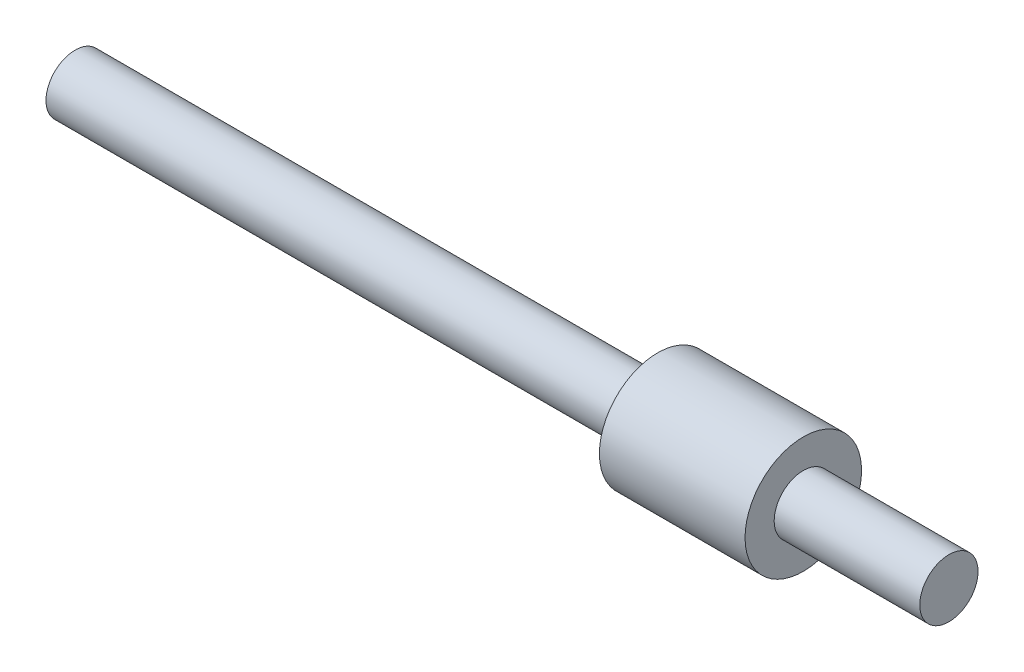
ISO-10303-21;
HEADER;
FILE_DESCRIPTION(('STEP AP214'),'2;1');
FILE_NAME('part.step','',(''),(''),'','','');
FILE_SCHEMA(('AUTOMOTIVE_DESIGN { 1 0 10303 214 1 1 1 1 }'));
ENDSEC;
DATA;
#1=APPLICATION_CONTEXT('core data for automotive mechanical design processes');
#2=APPLICATION_PROTOCOL_DEFINITION('international standard','automotive_design',2000,#1);
#3=PRODUCT_CONTEXT('',#1,'mechanical');
#4=PRODUCT('Part','Part','',(#3));
#5=PRODUCT_RELATED_PRODUCT_CATEGORY('part','',(#4));
#6=PRODUCT_DEFINITION_FORMATION('','',#4);
#7=PRODUCT_DEFINITION_CONTEXT('part definition',#1,'design');
#8=PRODUCT_DEFINITION('design','',#6,#7);
#9=PRODUCT_DEFINITION_SHAPE('','',#8);
#10=(LENGTH_UNIT() NAMED_UNIT(*) SI_UNIT(.MILLI.,.METRE.));
#11=(NAMED_UNIT(*) PLANE_ANGLE_UNIT() SI_UNIT($,.RADIAN.));
#12=(NAMED_UNIT(*) SI_UNIT($,.STERADIAN.) SOLID_ANGLE_UNIT());
#13=UNCERTAINTY_MEASURE_WITH_UNIT(LENGTH_MEASURE(1.E-05),#10,'distance_accuracy_value','');
#14=(GEOMETRIC_REPRESENTATION_CONTEXT(3) GLOBAL_UNCERTAINTY_ASSIGNED_CONTEXT((#13)) GLOBAL_UNIT_ASSIGNED_CONTEXT((#10,
#11,#12)) REPRESENTATION_CONTEXT('',''));
#15=CARTESIAN_POINT('',(0.,0.,0.));
#16=DIRECTION('',(0.,0.,1.));
#17=DIRECTION('',(1.,0.,0.));
#18=AXIS2_PLACEMENT_3D('',#15,#16,#17);
#19=CARTESIAN_POINT('',(0.,0.,0.));
#20=DIRECTION('',(1.,0.,0.));
#21=DIRECTION('',(0.,0.,-1.));
#22=AXIS2_PLACEMENT_3D('',#19,#20,#21);
#23=PLANE('',#22);
#24=CARTESIAN_POINT('',(0.,0.,0.));
#25=DIRECTION('',(-1.,0.,0.));
#26=DIRECTION('',(0.,0.,1.));
#27=AXIS2_PLACEMENT_3D('',#24,#25,#26);
#28=CIRCLE('',#27,5.);
#29=CARTESIAN_POINT('',(0.,0.,5.));
#30=VERTEX_POINT('',#29);
#31=EDGE_CURVE('E10',#30,#30,#28,.T.);
#32=ORIENTED_EDGE('',*,*,#31,.T.);
#33=EDGE_LOOP('',(#32));
#34=FACE_BOUND('',#33,.T.);
#35=ADVANCED_FACE('F41',(#34),#23,.F.);
#36=CARTESIAN_POINT('',(0.,0.,0.));
#37=DIRECTION('',(-1.,0.,0.));
#38=DIRECTION('',(0.,0.,1.));
#39=AXIS2_PLACEMENT_3D('',#36,#37,#38);
#40=CYLINDRICAL_SURFACE('',#39,5.);
#41=ORIENTED_EDGE('',*,*,#31,.F.);
#42=EDGE_LOOP('',(#41));
#43=FACE_BOUND('',#42,.T.);
#44=CARTESIAN_POINT('',(100.,0.,0.));
#45=DIRECTION('',(-1.,0.,0.));
#46=DIRECTION('',(0.,0.,1.));
#47=AXIS2_PLACEMENT_3D('',#44,#45,#46);
#48=CIRCLE('',#47,5.);
#49=CARTESIAN_POINT('',(100.,0.,5.));
#50=VERTEX_POINT('',#49);
#51=EDGE_CURVE('E48',#50,#50,#48,.T.);
#52=ORIENTED_EDGE('',*,*,#51,.T.);
#53=EDGE_LOOP('',(#52));
#54=FACE_BOUND('',#53,.T.);
#55=ADVANCED_FACE('F85',(#43,#54),#40,.T.);
#56=CARTESIAN_POINT('',(100.,5.,0.));
#57=DIRECTION('',(1.,0.,0.));
#58=DIRECTION('',(0.,0.,-1.));
#59=AXIS2_PLACEMENT_3D('',#56,#57,#58);
#60=PLANE('',#59);
#61=ORIENTED_EDGE('',*,*,#51,.F.);
#62=EDGE_LOOP('',(#61));
#63=FACE_BOUND('',#62,.T.);
#64=CARTESIAN_POINT('',(100.,0.,0.));
#65=DIRECTION('',(-1.,0.,0.));
#66=DIRECTION('',(0.,0.,1.));
#67=AXIS2_PLACEMENT_3D('',#64,#65,#66);
#68=CIRCLE('',#67,10.);
#69=CARTESIAN_POINT('',(100.,0.,10.));
#70=VERTEX_POINT('',#69);
#71=EDGE_CURVE('E53',#70,#70,#68,.T.);
#72=ORIENTED_EDGE('',*,*,#71,.T.);
#73=EDGE_LOOP('',(#72));
#74=FACE_BOUND('',#73,.T.);
#75=ADVANCED_FACE('F89',(#63,#74),#60,.F.);
#76=CARTESIAN_POINT('',(0.,0.,0.));
#77=DIRECTION('',(-1.,0.,0.));
#78=DIRECTION('',(0.,0.,1.));
#79=AXIS2_PLACEMENT_3D('',#76,#77,#78);
#80=CYLINDRICAL_SURFACE('',#79,10.);
#81=ORIENTED_EDGE('',*,*,#71,.F.);
#82=EDGE_LOOP('',(#81));
#83=FACE_BOUND('',#82,.T.);
#84=CARTESIAN_POINT('',(125.,0.,0.));
#85=DIRECTION('',(-1.,0.,0.));
#86=DIRECTION('',(0.,0.,1.));
#87=AXIS2_PLACEMENT_3D('',#84,#85,#86);
#88=CIRCLE('',#87,10.);
#89=CARTESIAN_POINT('',(125.,0.,10.));
#90=VERTEX_POINT('',#89);
#91=EDGE_CURVE('E58',#90,#90,#88,.T.);
#92=ORIENTED_EDGE('',*,*,#91,.T.);
#93=EDGE_LOOP('',(#92));
#94=FACE_BOUND('',#93,.T.);
#95=ADVANCED_FACE('F94',(#83,#94),#80,.T.);
#96=CARTESIAN_POINT('',(125.,10.,0.));
#97=DIRECTION('',(-1.,0.,0.));
#98=DIRECTION('',(0.,0.,1.));
#99=AXIS2_PLACEMENT_3D('',#96,#97,#98);
#100=PLANE('',#99);
#101=ORIENTED_EDGE('',*,*,#91,.F.);
#102=EDGE_LOOP('',(#101));
#103=FACE_BOUND('',#102,.T.);
#104=CARTESIAN_POINT('',(125.,0.,0.));
#105=DIRECTION('',(-1.,0.,0.));
#106=DIRECTION('',(0.,0.,1.));
#107=AXIS2_PLACEMENT_3D('',#104,#105,#106);
#108=CIRCLE('',#107,5.);
#109=CARTESIAN_POINT('',(125.,0.,5.));
#110=VERTEX_POINT('',#109);
#111=EDGE_CURVE('E64',#110,#110,#108,.T.);
#112=ORIENTED_EDGE('',*,*,#111,.T.);
#113=EDGE_LOOP('',(#112));
#114=FACE_BOUND('',#113,.T.);
#115=ADVANCED_FACE('F81',(#103,#114),#100,.F.);
#116=CARTESIAN_POINT('',(0.,0.,0.));
#117=DIRECTION('',(-1.,0.,0.));
#118=DIRECTION('',(0.,0.,1.));
#119=AXIS2_PLACEMENT_3D('',#116,#117,#118);
#120=CYLINDRICAL_SURFACE('',#119,5.);
#121=ORIENTED_EDGE('',*,*,#111,.F.);
#122=EDGE_LOOP('',(#121));
#123=FACE_BOUND('',#122,.T.);
#124=CARTESIAN_POINT('',(150.,0.,0.));
#125=DIRECTION('',(-1.,0.,0.));
#126=DIRECTION('',(0.,0.,1.));
#127=AXIS2_PLACEMENT_3D('',#124,#125,#126);
#128=CIRCLE('',#127,5.);
#129=CARTESIAN_POINT('',(150.,0.,5.));
#130=VERTEX_POINT('',#129);
#131=EDGE_CURVE('E68',#130,#130,#128,.T.);
#132=ORIENTED_EDGE('',*,*,#131,.T.);
#133=EDGE_LOOP('',(#132));
#134=FACE_BOUND('',#133,.T.);
#135=ADVANCED_FACE('F73',(#123,#134),#120,.T.);
#136=CARTESIAN_POINT('',(150.,5.,0.));
#137=DIRECTION('',(-1.,0.,0.));
#138=DIRECTION('',(0.,0.,1.));
#139=AXIS2_PLACEMENT_3D('',#136,#137,#138);
#140=PLANE('',#139);
#141=ORIENTED_EDGE('',*,*,#131,.F.);
#142=EDGE_LOOP('',(#141));
#143=FACE_BOUND('',#142,.T.);
#144=ADVANCED_FACE('F75',(#143),#140,.F.);
#145=CLOSED_SHELL('',(#35,#55,#75,#95,#115,#135,#144));
#146=MANIFOLD_SOLID_BREP('B2',#145);
#147=ADVANCED_BREP_SHAPE_REPRESENTATION('',(#18,#146),#14);
#148=SHAPE_DEFINITION_REPRESENTATION(#9,#147);
ENDSEC;
END-ISO-10303-21;
